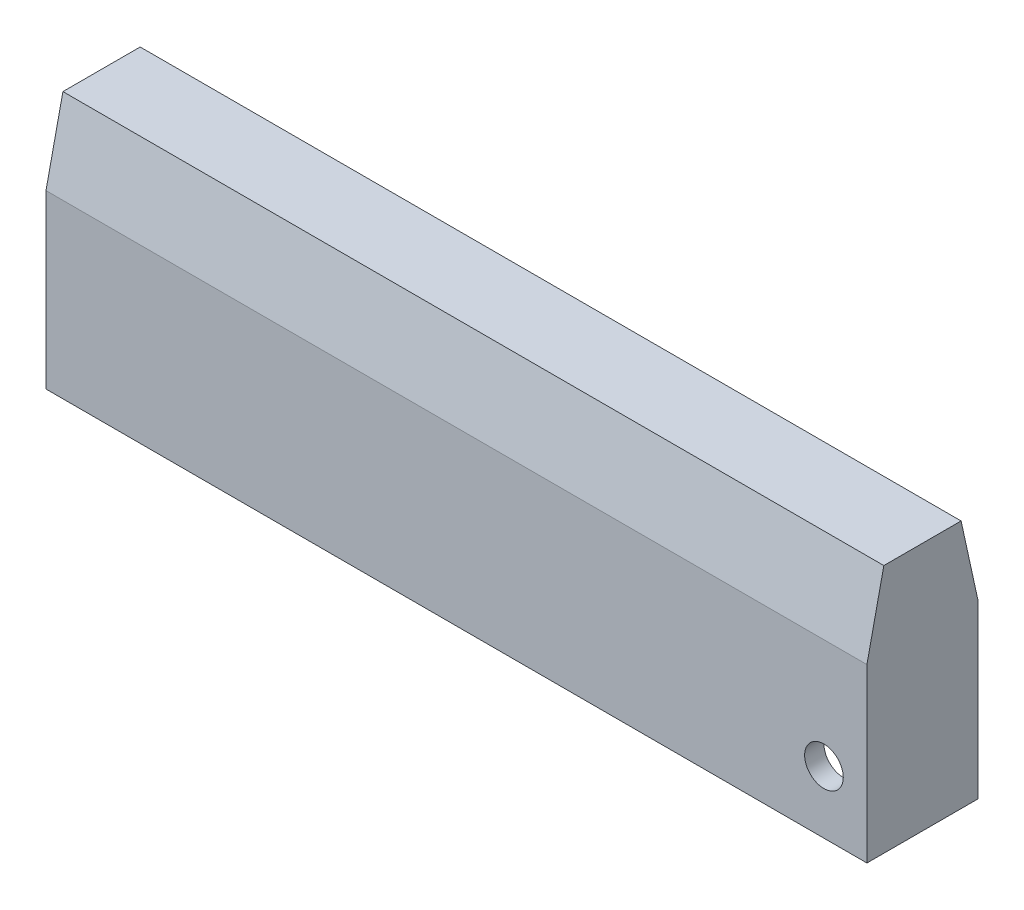
ISO-10303-21;
HEADER;
FILE_DESCRIPTION(('STEP AP214'),'2;1');
FILE_NAME('part.step','',(''),(''),'','','');
FILE_SCHEMA(('AUTOMOTIVE_DESIGN { 1 0 10303 214 1 1 1 1 }'));
ENDSEC;
DATA;
#1=APPLICATION_CONTEXT('core data for automotive mechanical design processes');
#2=APPLICATION_PROTOCOL_DEFINITION('international standard','automotive_design',2000,#1);
#3=PRODUCT_CONTEXT('',#1,'mechanical');
#4=PRODUCT('Part','Part','',(#3));
#5=PRODUCT_RELATED_PRODUCT_CATEGORY('part','',(#4));
#6=PRODUCT_DEFINITION_FORMATION('','',#4);
#7=PRODUCT_DEFINITION_CONTEXT('part definition',#1,'design');
#8=PRODUCT_DEFINITION('design','',#6,#7);
#9=PRODUCT_DEFINITION_SHAPE('','',#8);
#10=(LENGTH_UNIT() NAMED_UNIT(*) SI_UNIT(.MILLI.,.METRE.));
#11=(NAMED_UNIT(*) PLANE_ANGLE_UNIT() SI_UNIT($,.RADIAN.));
#12=(NAMED_UNIT(*) SI_UNIT($,.STERADIAN.) SOLID_ANGLE_UNIT());
#13=UNCERTAINTY_MEASURE_WITH_UNIT(LENGTH_MEASURE(1.E-05),#10,'distance_accuracy_value','');
#14=(GEOMETRIC_REPRESENTATION_CONTEXT(3) GLOBAL_UNCERTAINTY_ASSIGNED_CONTEXT((#13)) GLOBAL_UNIT_ASSIGNED_CONTEXT((#10,
#11,#12)) REPRESENTATION_CONTEXT('',''));
#15=CARTESIAN_POINT('',(0.,0.,0.));
#16=DIRECTION('',(0.,0.,1.));
#17=DIRECTION('',(1.,0.,0.));
#18=AXIS2_PLACEMENT_3D('',#15,#16,#17);
#19=CARTESIAN_POINT('',(-14.,89.3464811777375,3.75000000000001));
#20=DIRECTION('',(0.,0.,1.));
#21=DIRECTION('',(1.,0.,0.));
#22=AXIS2_PLACEMENT_3D('',#19,#20,#21);
#23=PLANE('',#22);
#24=CARTESIAN_POINT('',(64.5500000000001,-11.35,3.75000000000001));
#25=DIRECTION('',(0.,0.,1.));
#26=DIRECTION('',(1.,0.,0.));
#27=AXIS2_PLACEMENT_3D('',#24,#25,#26);
#28=CIRCLE('',#27,2.);
#29=CARTESIAN_POINT('',(66.5500000000001,-11.35,3.75000000000001));
#30=VERTEX_POINT('',#29);
#31=EDGE_CURVE('E54',#30,#30,#28,.F.);
#32=ORIENTED_EDGE('',*,*,#31,.F.);
#33=EDGE_LOOP('',(#32));
#34=FACE_BOUND('',#33,.T.);
#35=DIRECTION('',(1.,0.,0.));
#36=VECTOR('',#35,1.);
#37=CARTESIAN_POINT('',(-14.,-14.3,3.75000000000002));
#38=LINE('',#37,#36);
#39=CARTESIAN_POINT('',(-14.,-14.3,3.75000000000001));
#40=VERTEX_POINT('',#39);
#41=CARTESIAN_POINT('',(26.5,-14.3,3.75000000000001));
#42=VERTEX_POINT('',#41);
#43=EDGE_CURVE('E68',#40,#42,#38,.T.);
#44=ORIENTED_EDGE('',*,*,#43,.T.);
#45=DIRECTION('',(0.,1.,0.));
#46=VECTOR('',#45,1.);
#47=CARTESIAN_POINT('',(26.5,-14.3,3.75000000000002));
#48=LINE('',#47,#46);
#49=CARTESIAN_POINT('',(26.5,-12.3,3.75000000000001));
#50=VERTEX_POINT('',#49);
#51=EDGE_CURVE('E72',#42,#50,#48,.T.);
#52=ORIENTED_EDGE('',*,*,#51,.T.);
#53=DIRECTION('',(-1.,0.,0.));
#54=VECTOR('',#53,1.);
#55=CARTESIAN_POINT('',(-14.,-12.3,3.75000000000002));
#56=LINE('',#55,#54);
#57=CARTESIAN_POINT('',(-14.,-12.3,3.75000000000003));
#58=VERTEX_POINT('',#57);
#59=EDGE_CURVE('E164',#50,#58,#56,.T.);
#60=ORIENTED_EDGE('',*,*,#59,.T.);
#61=DIRECTION('',(0.,-1.,0.));
#62=VECTOR('',#61,1.);
#63=CARTESIAN_POINT('',(-14.,89.3464811777375,3.75000000000001));
#64=LINE('',#63,#62);
#65=CARTESIAN_POINT('',(-14.,0.,3.75000000000001));
#66=VERTEX_POINT('',#65);
#67=EDGE_CURVE('E152',#66,#58,#64,.T.);
#68=ORIENTED_EDGE('',*,*,#67,.F.);
#69=DIRECTION('',(-1.,0.,0.));
#70=VECTOR('',#69,1.);
#71=CARTESIAN_POINT('',(-14.,0.,3.75000000000001));
#72=LINE('',#71,#70);
#73=CARTESIAN_POINT('',(67.,0.,3.75000000000001));
#74=VERTEX_POINT('',#73);
#75=EDGE_CURVE('E192',#74,#66,#72,.T.);
#76=ORIENTED_EDGE('',*,*,#75,.F.);
#77=DIRECTION('',(0.,-1.,0.));
#78=VECTOR('',#77,1.);
#79=CARTESIAN_POINT('',(67.,89.3464811777375,3.75000000000001));
#80=LINE('',#79,#78);
#81=CARTESIAN_POINT('',(67.,-17.8,3.75000000000001));
#82=VERTEX_POINT('',#81);
#83=EDGE_CURVE('E210',#74,#82,#80,.T.);
#84=ORIENTED_EDGE('',*,*,#83,.T.);
#85=DIRECTION('',(-1.,0.,0.));
#86=VECTOR('',#85,1.);
#87=CARTESIAN_POINT('',(-14.,-17.8,3.75000000000001));
#88=LINE('',#87,#86);
#89=CARTESIAN_POINT('',(-14.,-17.8,3.75000000000001));
#90=VERTEX_POINT('',#89);
#91=EDGE_CURVE('E197',#82,#90,#88,.T.);
#92=ORIENTED_EDGE('',*,*,#91,.T.);
#93=EDGE_CURVE('E162',#40,#90,#64,.T.);
#94=ORIENTED_EDGE('',*,*,#93,.F.);
#95=EDGE_LOOP('',(#44,#52,#60,#68,#76,#84,#92,#94));
#96=FACE_BOUND('',#95,.T.);
#97=ADVANCED_FACE('F49',(#34,#96),#23,.F.);
#98=CARTESIAN_POINT('',(-14.,89.3464811777375,-3.75));
#99=DIRECTION('',(0.,0.,-1.));
#100=DIRECTION('',(-1.,0.,0.));
#101=AXIS2_PLACEMENT_3D('',#98,#99,#100);
#102=PLANE('',#101);
#103=CARTESIAN_POINT('',(64.5500000000001,-11.35,-3.75));
#104=DIRECTION('',(0.,0.,-1.));
#105=DIRECTION('',(-1.,0.,0.));
#106=AXIS2_PLACEMENT_3D('',#103,#104,#105);
#107=CIRCLE('',#106,2.);
#108=CARTESIAN_POINT('',(62.5500000000001,-11.35,-3.75));
#109=VERTEX_POINT('',#108);
#110=EDGE_CURVE('E227',#109,#109,#107,.F.);
#111=ORIENTED_EDGE('',*,*,#110,.F.);
#112=EDGE_LOOP('',(#111));
#113=FACE_BOUND('',#112,.T.);
#114=DIRECTION('',(1.,0.,0.));
#115=VECTOR('',#114,1.);
#116=CARTESIAN_POINT('',(-14.,-14.3,-3.75));
#117=LINE('',#116,#115);
#118=CARTESIAN_POINT('',(-14.,-14.3,-3.75));
#119=VERTEX_POINT('',#118);
#120=CARTESIAN_POINT('',(26.5,-14.3,-3.75));
#121=VERTEX_POINT('',#120);
#122=EDGE_CURVE('E188',#119,#121,#117,.T.);
#123=ORIENTED_EDGE('',*,*,#122,.F.);
#124=DIRECTION('',(0.,-1.,0.));
#125=VECTOR('',#124,1.);
#126=CARTESIAN_POINT('',(-14.,89.3464811777375,-3.75));
#127=LINE('',#126,#125);
#128=CARTESIAN_POINT('',(-14.,-17.8,-3.75));
#129=VERTEX_POINT('',#128);
#130=EDGE_CURVE('E219',#119,#129,#127,.T.);
#131=ORIENTED_EDGE('',*,*,#130,.T.);
#132=DIRECTION('',(1.,0.,0.));
#133=VECTOR('',#132,1.);
#134=CARTESIAN_POINT('',(-14.,-17.8,-3.75));
#135=LINE('',#134,#133);
#136=CARTESIAN_POINT('',(67.,-17.8,-3.75));
#137=VERTEX_POINT('',#136);
#138=EDGE_CURVE('E189',#129,#137,#135,.T.);
#139=ORIENTED_EDGE('',*,*,#138,.T.);
#140=DIRECTION('',(0.,-1.,0.));
#141=VECTOR('',#140,1.);
#142=CARTESIAN_POINT('',(67.,89.3464811777375,-3.75));
#143=LINE('',#142,#141);
#144=CARTESIAN_POINT('',(67.,0.,-3.75));
#145=VERTEX_POINT('',#144);
#146=EDGE_CURVE('E211',#145,#137,#143,.T.);
#147=ORIENTED_EDGE('',*,*,#146,.F.);
#148=DIRECTION('',(1.,0.,0.));
#149=VECTOR('',#148,1.);
#150=CARTESIAN_POINT('',(-14.,0.,-3.75));
#151=LINE('',#150,#149);
#152=CARTESIAN_POINT('',(-14.,0.,-3.75));
#153=VERTEX_POINT('',#152);
#154=EDGE_CURVE('E212',#153,#145,#151,.T.);
#155=ORIENTED_EDGE('',*,*,#154,.F.);
#156=CARTESIAN_POINT('',(-14.,-12.3,-3.75));
#157=VERTEX_POINT('',#156);
#158=EDGE_CURVE('E216',#153,#157,#127,.T.);
#159=ORIENTED_EDGE('',*,*,#158,.T.);
#160=DIRECTION('',(-1.,0.,0.));
#161=VECTOR('',#160,1.);
#162=CARTESIAN_POINT('',(-14.,-12.3,-3.75));
#163=LINE('',#162,#161);
#164=CARTESIAN_POINT('',(26.5,-12.3,-3.75));
#165=VERTEX_POINT('',#164);
#166=EDGE_CURVE('E173',#165,#157,#163,.T.);
#167=ORIENTED_EDGE('',*,*,#166,.F.);
#168=DIRECTION('',(0.,1.,0.));
#169=VECTOR('',#168,1.);
#170=CARTESIAN_POINT('',(26.5,-14.3,-3.75));
#171=LINE('',#170,#169);
#172=EDGE_CURVE('E552',#121,#165,#171,.T.);
#173=ORIENTED_EDGE('',*,*,#172,.F.);
#174=EDGE_LOOP('',(#123,#131,#139,#147,#155,#159,#167,#173));
#175=FACE_BOUND('',#174,.T.);
#176=ADVANCED_FACE('F305',(#113,#175),#102,.F.);
#177=CARTESIAN_POINT('',(-14.,89.3464811777375,-3.75));
#178=DIRECTION('',(-1.,0.,0.));
#179=DIRECTION('',(0.,0.,1.));
#180=AXIS2_PLACEMENT_3D('',#177,#178,#179);
#181=PLANE('',#180);
#182=DIRECTION('',(0.,0.,-1.));
#183=VECTOR('',#182,1.);
#184=CARTESIAN_POINT('',(-14.,-14.3,44.2993526458808));
#185=LINE('',#184,#183);
#186=EDGE_CURVE('E184',#40,#119,#185,.T.);
#187=ORIENTED_EDGE('',*,*,#186,.F.);
#188=ORIENTED_EDGE('',*,*,#93,.T.);
#189=DIRECTION('',(0.,0.,-1.));
#190=VECTOR('',#189,1.);
#191=CARTESIAN_POINT('',(-14.,-17.8,-3.75));
#192=LINE('',#191,#190);
#193=EDGE_CURVE('E193',#90,#129,#192,.T.);
#194=ORIENTED_EDGE('',*,*,#193,.T.);
#195=ORIENTED_EDGE('',*,*,#130,.F.);
#196=EDGE_LOOP('',(#187,#188,#194,#195));
#197=FACE_BOUND('',#196,.T.);
#198=ADVANCED_FACE('F310',(#197),#181,.F.);
#199=DIRECTION('',(0.,0.,-1.));
#200=VECTOR('',#199,1.);
#201=CARTESIAN_POINT('',(-14.,-12.3,44.2993526458808));
#202=LINE('',#201,#200);
#203=EDGE_CURVE('E156',#58,#157,#202,.T.);
#204=ORIENTED_EDGE('',*,*,#203,.T.);
#205=ORIENTED_EDGE('',*,*,#158,.F.);
#206=DIRECTION('',(0.,0.,-1.));
#207=VECTOR('',#206,1.);
#208=CARTESIAN_POINT('',(-14.,0.,-3.75));
#209=LINE('',#208,#207);
#210=EDGE_CURVE('E159',#66,#153,#209,.T.);
#211=ORIENTED_EDGE('',*,*,#210,.F.);
#212=ORIENTED_EDGE('',*,*,#67,.T.);
#213=EDGE_LOOP('',(#204,#205,#211,#212));
#214=FACE_BOUND('',#213,.T.);
#215=ADVANCED_FACE('F153',(#214),#181,.F.);
#216=CARTESIAN_POINT('',(64.5500000000001,-11.35,-11.4068542494924));
#217=DIRECTION('',(0.,0.,1.));
#218=DIRECTION('',(1.,0.,0.));
#219=AXIS2_PLACEMENT_3D('',#216,#217,#218);
#220=CYLINDRICAL_SURFACE('',#219,2.);
#221=ORIENTED_EDGE('',*,*,#31,.T.);
#222=EDGE_LOOP('',(#221));
#223=FACE_BOUND('',#222,.T.);
#224=CARTESIAN_POINT('',(64.5500000000001,-11.35,5.75));
#225=DIRECTION('',(0.,0.,1.));
#226=DIRECTION('',(1.,0.,0.));
#227=AXIS2_PLACEMENT_3D('',#224,#225,#226);
#228=CIRCLE('',#227,2.);
#229=CARTESIAN_POINT('',(66.5500000000001,-11.35,5.75));
#230=VERTEX_POINT('',#229);
#231=EDGE_CURVE('E245',#230,#230,#228,.T.);
#232=ORIENTED_EDGE('',*,*,#231,.T.);
#233=EDGE_LOOP('',(#232));
#234=FACE_BOUND('',#233,.T.);
#235=ADVANCED_FACE('F301',(#223,#234),#220,.F.);
#236=CARTESIAN_POINT('',(-69.,8.,5.75));
#237=DIRECTION('',(0.,0.,-1.));
#238=DIRECTION('',(-1.,0.,0.));
#239=AXIS2_PLACEMENT_3D('',#236,#237,#238);
#240=PLANE('',#239);
#241=ORIENTED_EDGE('',*,*,#231,.F.);
#242=EDGE_LOOP('',(#241));
#243=FACE_BOUND('',#242,.T.);
#244=DIRECTION('',(-1.,0.,0.));
#245=VECTOR('',#244,1.);
#246=CARTESIAN_POINT('',(-69.,-1.74314677549911E-13,5.75));
#247=LINE('',#246,#245);
#248=CARTESIAN_POINT('',(69.,-1.73472347597681E-13,5.75));
#249=VERTEX_POINT('',#248);
#250=CARTESIAN_POINT('',(-16.,-2.15105711021124E-13,5.75000000000001));
#251=VERTEX_POINT('',#250);
#252=EDGE_CURVE('E281',#249,#251,#247,.T.);
#253=ORIENTED_EDGE('',*,*,#252,.T.);
#254=DIRECTION('',(0.,-1.,0.));
#255=VECTOR('',#254,1.);
#256=CARTESIAN_POINT('',(-16.,62.2332923581079,5.75000000000001));
#257=LINE('',#256,#255);
#258=CARTESIAN_POINT('',(-16.,-17.8,5.75000000000001));
#259=VERTEX_POINT('',#258);
#260=EDGE_CURVE('E236',#251,#259,#257,.T.);
#261=ORIENTED_EDGE('',*,*,#260,.T.);
#262=DIRECTION('',(1.,0.,0.));
#263=VECTOR('',#262,1.);
#264=CARTESIAN_POINT('',(-69.,-17.8,5.75));
#265=LINE('',#264,#263);
#266=CARTESIAN_POINT('',(69.,-17.8,5.75));
#267=VERTEX_POINT('',#266);
#268=EDGE_CURVE('E253',#259,#267,#265,.T.);
#269=ORIENTED_EDGE('',*,*,#268,.T.);
#270=DIRECTION('',(0.,-1.,0.));
#271=VECTOR('',#270,1.);
#272=CARTESIAN_POINT('',(69.,8.,5.75));
#273=LINE('',#272,#271);
#274=EDGE_CURVE('E271',#249,#267,#273,.T.);
#275=ORIENTED_EDGE('',*,*,#274,.F.);
#276=EDGE_LOOP('',(#253,#261,#269,#275));
#277=FACE_BOUND('',#276,.T.);
#278=ADVANCED_FACE('F343',(#243,#277),#240,.F.);
#279=CARTESIAN_POINT('',(69.,8.,5.75));
#280=DIRECTION('',(-1.,0.,0.));
#281=DIRECTION('',(0.,0.,1.));
#282=AXIS2_PLACEMENT_3D('',#279,#280,#281);
#283=PLANE('',#282);
#284=DIRECTION('',(0.,-1.,0.));
#285=VECTOR('',#284,1.);
#286=CARTESIAN_POINT('',(69.,8.,-5.75));
#287=LINE('',#286,#285);
#288=CARTESIAN_POINT('',(69.,0.,-5.75));
#289=VERTEX_POINT('',#288);
#290=CARTESIAN_POINT('',(69.,-17.8,-5.75));
#291=VERTEX_POINT('',#290);
#292=EDGE_CURVE('E267',#289,#291,#287,.T.);
#293=ORIENTED_EDGE('',*,*,#292,.F.);
#294=DIRECTION('',(0.,-0.976900017396262,-0.21369687880543));
#295=VECTOR('',#294,1.);
#296=CARTESIAN_POINT('',(69.,0.,-5.75));
#297=LINE('',#296,#295);
#298=CARTESIAN_POINT('',(69.,8.,-4.));
#299=VERTEX_POINT('',#298);
#300=EDGE_CURVE('E288',#289,#299,#297,.F.);
#301=ORIENTED_EDGE('',*,*,#300,.T.);
#302=DIRECTION('',(0.,0.,-1.));
#303=VECTOR('',#302,1.);
#304=CARTESIAN_POINT('',(69.,8.,5.75));
#305=LINE('',#304,#303);
#306=CARTESIAN_POINT('',(69.,8.,3.99999999999999));
#307=VERTEX_POINT('',#306);
#308=EDGE_CURVE('E263',#307,#299,#305,.T.);
#309=ORIENTED_EDGE('',*,*,#308,.F.);
#310=DIRECTION('',(0.,-0.976900017396262,0.213696878805429));
#311=VECTOR('',#310,1.);
#312=CARTESIAN_POINT('',(69.,8.,3.99999999999999));
#313=LINE('',#312,#311);
#314=EDGE_CURVE('E278',#307,#249,#313,.T.);
#315=ORIENTED_EDGE('',*,*,#314,.T.);
#316=ORIENTED_EDGE('',*,*,#274,.T.);
#317=DIRECTION('',(0.,0.,-1.));
#318=VECTOR('',#317,1.);
#319=CARTESIAN_POINT('',(69.,-17.8,5.75));
#320=LINE('',#319,#318);
#321=EDGE_CURVE('E256',#267,#291,#320,.T.);
#322=ORIENTED_EDGE('',*,*,#321,.T.);
#323=EDGE_LOOP('',(#293,#301,#309,#315,#316,#322));
#324=FACE_BOUND('',#323,.T.);
#325=ADVANCED_FACE('F339',(#324),#283,.F.);
#326=CARTESIAN_POINT('',(-69.,8.,-5.75));
#327=DIRECTION('',(0.,0.,-1.));
#328=DIRECTION('',(-1.,0.,0.));
#329=AXIS2_PLACEMENT_3D('',#326,#327,#328);
#330=PLANE('',#329);
#331=DIRECTION('',(0.,-1.,0.));
#332=VECTOR('',#331,1.);
#333=CARTESIAN_POINT('',(-16.,62.2332923581079,-5.74999999999999));
#334=LINE('',#333,#332);
#335=CARTESIAN_POINT('',(-16.,1.96293742366449E-13,-5.74999999999996));
#336=VERTEX_POINT('',#335);
#337=CARTESIAN_POINT('',(-16.,-17.8,-5.74999999999999));
#338=VERTEX_POINT('',#337);
#339=EDGE_CURVE('E231',#336,#338,#334,.T.);
#340=ORIENTED_EDGE('',*,*,#339,.F.);
#341=DIRECTION('',(1.,0.,0.));
#342=VECTOR('',#341,1.);
#343=CARTESIAN_POINT('',(-69.,0.,-5.75));
#344=LINE('',#343,#342);
#345=EDGE_CURVE('E285',#336,#289,#344,.T.);
#346=ORIENTED_EDGE('',*,*,#345,.T.);
#347=ORIENTED_EDGE('',*,*,#292,.T.);
#348=DIRECTION('',(1.,0.,0.));
#349=VECTOR('',#348,1.);
#350=CARTESIAN_POINT('',(-69.,-17.8,-5.75));
#351=LINE('',#350,#349);
#352=EDGE_CURVE('E260',#338,#291,#351,.T.);
#353=ORIENTED_EDGE('',*,*,#352,.F.);
#354=EDGE_LOOP('',(#340,#346,#347,#353));
#355=FACE_BOUND('',#354,.T.);
#356=CARTESIAN_POINT('',(64.5500000000001,-11.35,-5.75));
#357=DIRECTION('',(0.,0.,-1.));
#358=DIRECTION('',(-1.,0.,0.));
#359=AXIS2_PLACEMENT_3D('',#356,#357,#358);
#360=CIRCLE('',#359,2.);
#361=CARTESIAN_POINT('',(62.5500000000001,-11.35,-5.75));
#362=VERTEX_POINT('',#361);
#363=EDGE_CURVE('E249',#362,#362,#360,.F.);
#364=ORIENTED_EDGE('',*,*,#363,.T.);
#365=EDGE_LOOP('',(#364));
#366=FACE_BOUND('',#365,.T.);
#367=ADVANCED_FACE('F335',(#355,#366),#330,.T.);
#368=CARTESIAN_POINT('',(0.,8.,0.));
#369=DIRECTION('',(0.,1.,0.));
#370=DIRECTION('',(0.,0.,1.));
#371=AXIS2_PLACEMENT_3D('',#368,#369,#370);
#372=PLANE('',#371);
#373=DIRECTION('',(0.,0.,1.));
#374=VECTOR('',#373,1.);
#375=CARTESIAN_POINT('',(-16.,8.,5.75000000000001));
#376=LINE('',#375,#374);
#377=CARTESIAN_POINT('',(-16.,8.,-4.));
#378=VERTEX_POINT('',#377);
#379=CARTESIAN_POINT('',(-16.,8.,3.99999999999999));
#380=VERTEX_POINT('',#379);
#381=EDGE_CURVE('E232',#378,#380,#376,.T.);
#382=ORIENTED_EDGE('',*,*,#381,.T.);
#383=DIRECTION('',(1.,0.,0.));
#384=VECTOR('',#383,1.);
#385=CARTESIAN_POINT('',(69.,8.,3.99999999999999));
#386=LINE('',#385,#384);
#387=EDGE_CURVE('E275',#380,#307,#386,.T.);
#388=ORIENTED_EDGE('',*,*,#387,.T.);
#389=ORIENTED_EDGE('',*,*,#308,.T.);
#390=DIRECTION('',(-1.,0.,0.));
#391=VECTOR('',#390,1.);
#392=CARTESIAN_POINT('',(0.,8.,-4.));
#393=LINE('',#392,#391);
#394=EDGE_CURVE('E60',#299,#378,#393,.T.);
#395=ORIENTED_EDGE('',*,*,#394,.T.);
#396=EDGE_LOOP('',(#382,#388,#389,#395));
#397=FACE_BOUND('',#396,.T.);
#398=ADVANCED_FACE('F331',(#397),#372,.T.);
#399=CARTESIAN_POINT('',(0.,-17.8,0.));
#400=DIRECTION('',(0.,1.,0.));
#401=DIRECTION('',(0.,0.,1.));
#402=AXIS2_PLACEMENT_3D('',#399,#400,#401);
#403=PLANE('',#402);
#404=ORIENTED_EDGE('',*,*,#193,.F.);
#405=ORIENTED_EDGE('',*,*,#91,.F.);
#406=DIRECTION('',(0.,0.,1.));
#407=VECTOR('',#406,1.);
#408=CARTESIAN_POINT('',(67.,-17.8,-3.75));
#409=LINE('',#408,#407);
#410=EDGE_CURVE('E169',#137,#82,#409,.T.);
#411=ORIENTED_EDGE('',*,*,#410,.F.);
#412=ORIENTED_EDGE('',*,*,#138,.F.);
#413=EDGE_LOOP('',(#404,#405,#411,#412));
#414=FACE_BOUND('',#413,.T.);
#415=ORIENTED_EDGE('',*,*,#268,.F.);
#416=DIRECTION('',(0.,0.,1.));
#417=VECTOR('',#416,1.);
#418=CARTESIAN_POINT('',(-16.,-17.8,5.75000000000001));
#419=LINE('',#418,#417);
#420=EDGE_CURVE('E228',#338,#259,#419,.T.);
#421=ORIENTED_EDGE('',*,*,#420,.F.);
#422=ORIENTED_EDGE('',*,*,#352,.T.);
#423=ORIENTED_EDGE('',*,*,#321,.F.);
#424=EDGE_LOOP('',(#415,#421,#422,#423));
#425=FACE_BOUND('',#424,.T.);
#426=ADVANCED_FACE('F328',(#414,#425),#403,.F.);
#427=ORIENTED_EDGE('',*,*,#110,.T.);
#428=EDGE_LOOP('',(#427));
#429=FACE_BOUND('',#428,.T.);
#430=ORIENTED_EDGE('',*,*,#363,.F.);
#431=EDGE_LOOP('',(#430));
#432=FACE_BOUND('',#431,.T.);
#433=ADVANCED_FACE('F324',(#429,#432),#220,.F.);
#434=CARTESIAN_POINT('',(0.,8.,3.99999999999999));
#435=DIRECTION('',(0.,0.213696878805429,0.976900017396262));
#436=DIRECTION('',(-1.,0.,0.));
#437=AXIS2_PLACEMENT_3D('',#434,#435,#436);
#438=PLANE('',#437);
#439=DIRECTION('',(0.,0.976900017396262,-0.213696878805429));
#440=VECTOR('',#439,1.);
#441=CARTESIAN_POINT('',(-16.,8.,3.99999999999999));
#442=LINE('',#441,#440);
#443=EDGE_CURVE('E240',#251,#380,#442,.T.);
#444=ORIENTED_EDGE('',*,*,#443,.F.);
#445=ORIENTED_EDGE('',*,*,#252,.F.);
#446=ORIENTED_EDGE('',*,*,#314,.F.);
#447=ORIENTED_EDGE('',*,*,#387,.F.);
#448=EDGE_LOOP('',(#444,#445,#446,#447));
#449=FACE_BOUND('',#448,.T.);
#450=ADVANCED_FACE('F327',(#449),#438,.T.);
#451=CARTESIAN_POINT('',(-69.,0.,-5.75));
#452=DIRECTION('',(0.,-0.21369687880543,0.976900017396262));
#453=DIRECTION('',(1.,0.,0.));
#454=AXIS2_PLACEMENT_3D('',#451,#452,#453);
#455=PLANE('',#454);
#456=DIRECTION('',(0.,0.976900017396262,0.21369687880543));
#457=VECTOR('',#456,1.);
#458=CARTESIAN_POINT('',(-16.,0.,-5.75));
#459=LINE('',#458,#457);
#460=EDGE_CURVE('E12',#378,#336,#459,.F.);
#461=ORIENTED_EDGE('',*,*,#460,.F.);
#462=ORIENTED_EDGE('',*,*,#394,.F.);
#463=ORIENTED_EDGE('',*,*,#300,.F.);
#464=ORIENTED_EDGE('',*,*,#345,.F.);
#465=EDGE_LOOP('',(#461,#462,#463,#464));
#466=FACE_BOUND('',#465,.T.);
#467=ADVANCED_FACE('F52',(#466),#455,.F.);
#468=CARTESIAN_POINT('',(-16.,62.2332923581079,5.75000000000001));
#469=DIRECTION('',(1.,0.,0.));
#470=DIRECTION('',(0.,0.,-1.));
#471=AXIS2_PLACEMENT_3D('',#468,#469,#470);
#472=PLANE('',#471);
#473=ORIENTED_EDGE('',*,*,#443,.T.);
#474=ORIENTED_EDGE('',*,*,#381,.F.);
#475=ORIENTED_EDGE('',*,*,#460,.T.);
#476=ORIENTED_EDGE('',*,*,#339,.T.);
#477=ORIENTED_EDGE('',*,*,#420,.T.);
#478=ORIENTED_EDGE('',*,*,#260,.F.);
#479=EDGE_LOOP('',(#473,#474,#475,#476,#477,#478));
#480=FACE_BOUND('',#479,.T.);
#481=ADVANCED_FACE('F319',(#480),#472,.F.);
#482=CARTESIAN_POINT('',(0.,0.,0.));
#483=DIRECTION('',(0.,1.,0.));
#484=DIRECTION('',(0.,0.,1.));
#485=AXIS2_PLACEMENT_3D('',#482,#483,#484);
#486=PLANE('',#485);
#487=DIRECTION('',(0.,0.,1.));
#488=VECTOR('',#487,1.);
#489=CARTESIAN_POINT('',(67.,0.,-3.75));
#490=LINE('',#489,#488);
#491=EDGE_CURVE('E206',#145,#74,#490,.T.);
#492=ORIENTED_EDGE('',*,*,#491,.T.);
#493=ORIENTED_EDGE('',*,*,#75,.T.);
#494=ORIENTED_EDGE('',*,*,#210,.T.);
#495=ORIENTED_EDGE('',*,*,#154,.T.);
#496=EDGE_LOOP('',(#492,#493,#494,#495));
#497=FACE_BOUND('',#496,.T.);
#498=ADVANCED_FACE('F315',(#497),#486,.F.);
#499=CARTESIAN_POINT('',(67.,89.3464811777375,-3.75));
#500=DIRECTION('',(1.,0.,0.));
#501=DIRECTION('',(0.,0.,-1.));
#502=AXIS2_PLACEMENT_3D('',#499,#500,#501);
#503=PLANE('',#502);
#504=ORIENTED_EDGE('',*,*,#146,.T.);
#505=ORIENTED_EDGE('',*,*,#410,.T.);
#506=ORIENTED_EDGE('',*,*,#83,.F.);
#507=ORIENTED_EDGE('',*,*,#491,.F.);
#508=EDGE_LOOP('',(#504,#505,#506,#507));
#509=FACE_BOUND('',#508,.T.);
#510=ADVANCED_FACE('F318',(#509),#503,.F.);
#511=CARTESIAN_POINT('',(-14.,-14.3,44.2993526458808));
#512=DIRECTION('',(0.,1.,0.));
#513=DIRECTION('',(-1.,0.,0.));
#514=AXIS2_PLACEMENT_3D('',#511,#512,#513);
#515=PLANE('',#514);
#516=ORIENTED_EDGE('',*,*,#43,.F.);
#517=ORIENTED_EDGE('',*,*,#186,.T.);
#518=ORIENTED_EDGE('',*,*,#122,.T.);
#519=DIRECTION('',(0.,0.,-1.));
#520=VECTOR('',#519,1.);
#521=CARTESIAN_POINT('',(26.5,-14.3,44.2993526458808));
#522=LINE('',#521,#520);
#523=EDGE_CURVE('E549',#42,#121,#522,.T.);
#524=ORIENTED_EDGE('',*,*,#523,.F.);
#525=EDGE_LOOP('',(#516,#517,#518,#524));
#526=FACE_BOUND('',#525,.T.);
#527=ADVANCED_FACE('F395',(#526),#515,.F.);
#528=CARTESIAN_POINT('',(26.5,-14.3,44.2993526458808));
#529=DIRECTION('',(-1.,0.,0.));
#530=DIRECTION('',(0.,-1.,0.));
#531=AXIS2_PLACEMENT_3D('',#528,#529,#530);
#532=PLANE('',#531);
#533=ORIENTED_EDGE('',*,*,#51,.F.);
#534=ORIENTED_EDGE('',*,*,#523,.T.);
#535=ORIENTED_EDGE('',*,*,#172,.T.);
#536=DIRECTION('',(0.,0.,-1.));
#537=VECTOR('',#536,1.);
#538=CARTESIAN_POINT('',(26.5,-12.3,44.2993526458808));
#539=LINE('',#538,#537);
#540=EDGE_CURVE('E179',#50,#165,#539,.T.);
#541=ORIENTED_EDGE('',*,*,#540,.F.);
#542=EDGE_LOOP('',(#533,#534,#535,#541));
#543=FACE_BOUND('',#542,.T.);
#544=ADVANCED_FACE('F403',(#543),#532,.F.);
#545=CARTESIAN_POINT('',(-14.,-12.3,44.2993526458808));
#546=DIRECTION('',(0.,-1.,0.));
#547=DIRECTION('',(1.,0.,0.));
#548=AXIS2_PLACEMENT_3D('',#545,#546,#547);
#549=PLANE('',#548);
#550=ORIENTED_EDGE('',*,*,#59,.F.);
#551=ORIENTED_EDGE('',*,*,#540,.T.);
#552=ORIENTED_EDGE('',*,*,#166,.T.);
#553=ORIENTED_EDGE('',*,*,#203,.F.);
#554=EDGE_LOOP('',(#550,#551,#552,#553));
#555=FACE_BOUND('',#554,.T.);
#556=ADVANCED_FACE('F172',(#555),#549,.F.);
#557=CLOSED_SHELL('',(#97,#176,#198,#215,#235,#278,#325,#367,#398,#426,#433,#450,#467,#481,#498,
#510,#527,#544,#556));
#558=MANIFOLD_SOLID_BREP('B2',#557);
#559=ADVANCED_BREP_SHAPE_REPRESENTATION('',(#18,#558),#14);
#560=SHAPE_DEFINITION_REPRESENTATION(#9,#559);
ENDSEC;
END-ISO-10303-21;
